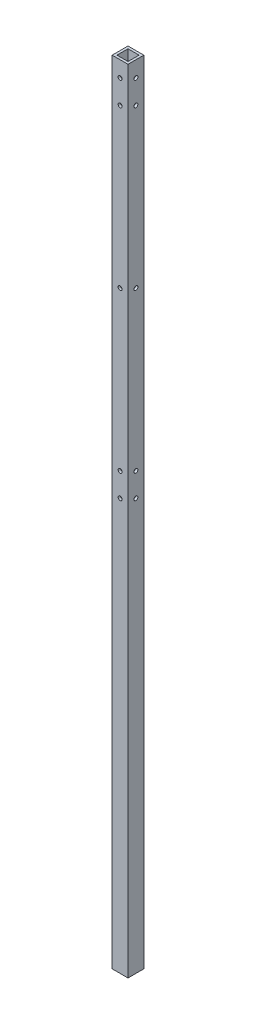
ISO-10303-21;
HEADER;
FILE_DESCRIPTION(('STEP AP214'),'2;1');
FILE_NAME('part.step','',(''),(''),'','','');
FILE_SCHEMA(('AUTOMOTIVE_DESIGN { 1 0 10303 214 1 1 1 1 }'));
ENDSEC;
DATA;
#1=APPLICATION_CONTEXT('core data for automotive mechanical design processes');
#2=APPLICATION_PROTOCOL_DEFINITION('international standard','automotive_design',2000,#1);
#3=PRODUCT_CONTEXT('',#1,'mechanical');
#4=PRODUCT('Part','Part','',(#3));
#5=PRODUCT_RELATED_PRODUCT_CATEGORY('part','',(#4));
#6=PRODUCT_DEFINITION_FORMATION('','',#4);
#7=PRODUCT_DEFINITION_CONTEXT('part definition',#1,'design');
#8=PRODUCT_DEFINITION('design','',#6,#7);
#9=PRODUCT_DEFINITION_SHAPE('','',#8);
#10=(LENGTH_UNIT() NAMED_UNIT(*) SI_UNIT(.MILLI.,.METRE.));
#11=(NAMED_UNIT(*) PLANE_ANGLE_UNIT() SI_UNIT($,.RADIAN.));
#12=(NAMED_UNIT(*) SI_UNIT($,.STERADIAN.) SOLID_ANGLE_UNIT());
#13=UNCERTAINTY_MEASURE_WITH_UNIT(LENGTH_MEASURE(1.E-05),#10,'distance_accuracy_value','');
#14=(GEOMETRIC_REPRESENTATION_CONTEXT(3) GLOBAL_UNCERTAINTY_ASSIGNED_CONTEXT((#13)) GLOBAL_UNIT_ASSIGNED_CONTEXT((#10,
#11,#12)) REPRESENTATION_CONTEXT('',''));
#15=CARTESIAN_POINT('',(0.,0.,0.));
#16=DIRECTION('',(0.,0.,1.));
#17=DIRECTION('',(1.,0.,0.));
#18=AXIS2_PLACEMENT_3D('',#15,#16,#17);
#19=CARTESIAN_POINT('',(10.,520.,-10.));
#20=DIRECTION('',(1.,0.,0.));
#21=DIRECTION('',(0.,0.,-1.));
#22=AXIS2_PLACEMENT_3D('',#19,#20,#21);
#23=CYLINDRICAL_SURFACE('',#22,2.5);
#24=CARTESIAN_POINT('',(17.,520.,-10.));
#25=DIRECTION('',(-1.,0.,0.));
#26=DIRECTION('',(0.,0.,1.));
#27=AXIS2_PLACEMENT_3D('',#24,#25,#26);
#28=CIRCLE('',#27,2.5);
#29=CARTESIAN_POINT('',(17.,520.,-7.5));
#30=VERTEX_POINT('',#29);
#31=EDGE_CURVE('E47',#30,#30,#28,.T.);
#32=ORIENTED_EDGE('',*,*,#31,.T.);
#33=EDGE_LOOP('',(#32));
#34=FACE_BOUND('',#33,.T.);
#35=CARTESIAN_POINT('',(20.,520.,-10.));
#36=DIRECTION('',(1.,0.,0.));
#37=DIRECTION('',(0.,0.,-1.));
#38=AXIS2_PLACEMENT_3D('',#35,#36,#37);
#39=CIRCLE('',#38,2.5);
#40=CARTESIAN_POINT('',(20.,520.,-12.5));
#41=VERTEX_POINT('',#40);
#42=EDGE_CURVE('E11',#41,#41,#39,.T.);
#43=ORIENTED_EDGE('',*,*,#42,.T.);
#44=EDGE_LOOP('',(#43));
#45=FACE_BOUND('',#44,.T.);
#46=ADVANCED_FACE('F38',(#34,#45),#23,.F.);
#47=CARTESIAN_POINT('',(0.,1000.,0.));
#48=DIRECTION('',(0.,-1.,0.));
#49=DIRECTION('',(0.,0.,-1.));
#50=AXIS2_PLACEMENT_3D('',#47,#48,#49);
#51=PLANE('',#50);
#52=DIRECTION('',(0.,0.,1.));
#53=VECTOR('',#52,1.);
#54=CARTESIAN_POINT('',(0.,1000.,0.));
#55=LINE('',#54,#53);
#56=CARTESIAN_POINT('',(0.,1000.,-20.));
#57=VERTEX_POINT('',#56);
#58=CARTESIAN_POINT('',(0.,1000.,0.));
#59=VERTEX_POINT('',#58);
#60=EDGE_CURVE('E156',#57,#59,#55,.T.);
#61=ORIENTED_EDGE('',*,*,#60,.T.);
#62=DIRECTION('',(1.,0.,0.));
#63=VECTOR('',#62,1.);
#64=CARTESIAN_POINT('',(0.,1000.,0.));
#65=LINE('',#64,#63);
#66=CARTESIAN_POINT('',(20.,1000.,0.));
#67=VERTEX_POINT('',#66);
#68=EDGE_CURVE('E160',#59,#67,#65,.T.);
#69=ORIENTED_EDGE('',*,*,#68,.T.);
#70=DIRECTION('',(0.,0.,-1.));
#71=VECTOR('',#70,1.);
#72=CARTESIAN_POINT('',(20.,1000.,0.));
#73=LINE('',#72,#71);
#74=CARTESIAN_POINT('',(20.,1000.,-20.));
#75=VERTEX_POINT('',#74);
#76=EDGE_CURVE('E164',#67,#75,#73,.T.);
#77=ORIENTED_EDGE('',*,*,#76,.T.);
#78=DIRECTION('',(-1.,0.,0.));
#79=VECTOR('',#78,1.);
#80=CARTESIAN_POINT('',(0.,1000.,-20.));
#81=LINE('',#80,#79);
#82=EDGE_CURVE('E167',#75,#57,#81,.T.);
#83=ORIENTED_EDGE('',*,*,#82,.T.);
#84=EDGE_LOOP('',(#61,#69,#77,#83));
#85=FACE_BOUND('',#84,.T.);
#86=DIRECTION('',(0.,0.,1.));
#87=VECTOR('',#86,1.);
#88=CARTESIAN_POINT('',(3.,1000.,-17.));
#89=LINE('',#88,#87);
#90=CARTESIAN_POINT('',(3.,1000.,-17.));
#91=VERTEX_POINT('',#90);
#92=CARTESIAN_POINT('',(3.,1000.,-3.));
#93=VERTEX_POINT('',#92);
#94=EDGE_CURVE('E105',#91,#93,#89,.T.);
#95=ORIENTED_EDGE('',*,*,#94,.F.);
#96=DIRECTION('',(-1.,0.,0.));
#97=VECTOR('',#96,1.);
#98=CARTESIAN_POINT('',(3.,1000.,-17.));
#99=LINE('',#98,#97);
#100=CARTESIAN_POINT('',(17.,1000.,-17.));
#101=VERTEX_POINT('',#100);
#102=EDGE_CURVE('E132',#101,#91,#99,.T.);
#103=ORIENTED_EDGE('',*,*,#102,.F.);
#104=DIRECTION('',(0.,0.,-1.));
#105=VECTOR('',#104,1.);
#106=CARTESIAN_POINT('',(17.,1000.,-17.));
#107=LINE('',#106,#105);
#108=CARTESIAN_POINT('',(17.,1000.,-3.));
#109=VERTEX_POINT('',#108);
#110=EDGE_CURVE('E128',#109,#101,#107,.T.);
#111=ORIENTED_EDGE('',*,*,#110,.F.);
#112=DIRECTION('',(1.,0.,0.));
#113=VECTOR('',#112,1.);
#114=CARTESIAN_POINT('',(3.,1000.,-3.));
#115=LINE('',#114,#113);
#116=EDGE_CURVE('E114',#93,#109,#115,.T.);
#117=ORIENTED_EDGE('',*,*,#116,.F.);
#118=EDGE_LOOP('',(#95,#103,#111,#117));
#119=FACE_BOUND('',#118,.T.);
#120=ADVANCED_FACE('F127',(#85,#119),#51,.F.);
#121=CARTESIAN_POINT('',(0.,0.,0.));
#122=DIRECTION('',(0.,-1.,0.));
#123=DIRECTION('',(0.,0.,-1.));
#124=AXIS2_PLACEMENT_3D('',#121,#122,#123);
#125=PLANE('',#124);
#126=DIRECTION('',(0.,0.,1.));
#127=VECTOR('',#126,1.);
#128=CARTESIAN_POINT('',(0.,0.,0.));
#129=LINE('',#128,#127);
#130=CARTESIAN_POINT('',(0.,0.,-20.));
#131=VERTEX_POINT('',#130);
#132=CARTESIAN_POINT('',(0.,0.,0.));
#133=VERTEX_POINT('',#132);
#134=EDGE_CURVE('E123',#131,#133,#129,.T.);
#135=ORIENTED_EDGE('',*,*,#134,.F.);
#136=DIRECTION('',(-1.,0.,0.));
#137=VECTOR('',#136,1.);
#138=CARTESIAN_POINT('',(0.,0.,-20.));
#139=LINE('',#138,#137);
#140=CARTESIAN_POINT('',(20.,0.,-20.));
#141=VERTEX_POINT('',#140);
#142=EDGE_CURVE('E161',#141,#131,#139,.T.);
#143=ORIENTED_EDGE('',*,*,#142,.F.);
#144=DIRECTION('',(0.,0.,-1.));
#145=VECTOR('',#144,1.);
#146=CARTESIAN_POINT('',(20.,0.,0.));
#147=LINE('',#146,#145);
#148=CARTESIAN_POINT('',(20.,0.,0.));
#149=VERTEX_POINT('',#148);
#150=EDGE_CURVE('E177',#149,#141,#147,.T.);
#151=ORIENTED_EDGE('',*,*,#150,.F.);
#152=DIRECTION('',(1.,0.,0.));
#153=VECTOR('',#152,1.);
#154=CARTESIAN_POINT('',(0.,0.,0.));
#155=LINE('',#154,#153);
#156=EDGE_CURVE('E174',#133,#149,#155,.T.);
#157=ORIENTED_EDGE('',*,*,#156,.F.);
#158=EDGE_LOOP('',(#135,#143,#151,#157));
#159=FACE_BOUND('',#158,.T.);
#160=DIRECTION('',(-1.,0.,0.));
#161=VECTOR('',#160,1.);
#162=CARTESIAN_POINT('',(3.,0.,-17.));
#163=LINE('',#162,#161);
#164=CARTESIAN_POINT('',(17.,0.,-17.));
#165=VERTEX_POINT('',#164);
#166=CARTESIAN_POINT('',(3.,0.,-17.));
#167=VERTEX_POINT('',#166);
#168=EDGE_CURVE('E115',#165,#167,#163,.T.);
#169=ORIENTED_EDGE('',*,*,#168,.T.);
#170=DIRECTION('',(0.,0.,1.));
#171=VECTOR('',#170,1.);
#172=CARTESIAN_POINT('',(3.,0.,-17.));
#173=LINE('',#172,#171);
#174=CARTESIAN_POINT('',(3.,0.,-3.));
#175=VERTEX_POINT('',#174);
#176=EDGE_CURVE('E63',#167,#175,#173,.T.);
#177=ORIENTED_EDGE('',*,*,#176,.T.);
#178=DIRECTION('',(1.,0.,0.));
#179=VECTOR('',#178,1.);
#180=CARTESIAN_POINT('',(3.,0.,-3.));
#181=LINE('',#180,#179);
#182=CARTESIAN_POINT('',(17.,0.,-3.));
#183=VERTEX_POINT('',#182);
#184=EDGE_CURVE('E121',#175,#183,#181,.T.);
#185=ORIENTED_EDGE('',*,*,#184,.T.);
#186=DIRECTION('',(0.,0.,-1.));
#187=VECTOR('',#186,1.);
#188=CARTESIAN_POINT('',(17.,0.,-17.));
#189=LINE('',#188,#187);
#190=EDGE_CURVE('E143',#183,#165,#189,.T.);
#191=ORIENTED_EDGE('',*,*,#190,.T.);
#192=EDGE_LOOP('',(#169,#177,#185,#191));
#193=FACE_BOUND('',#192,.T.);
#194=ADVANCED_FACE('F333',(#159,#193),#125,.T.);
#195=CARTESIAN_POINT('',(0.,1000.,0.));
#196=DIRECTION('',(1.,0.,0.));
#197=DIRECTION('',(0.,0.,-1.));
#198=AXIS2_PLACEMENT_3D('',#195,#196,#197);
#199=PLANE('',#198);
#200=CARTESIAN_POINT('',(0.,950.,-10.));
#201=DIRECTION('',(-1.,0.,0.));
#202=DIRECTION('',(0.,0.,1.));
#203=AXIS2_PLACEMENT_3D('',#200,#201,#202);
#204=CIRCLE('',#203,2.5);
#205=CARTESIAN_POINT('',(0.,950.,-7.5));
#206=VERTEX_POINT('',#205);
#207=EDGE_CURVE('E254',#206,#206,#204,.T.);
#208=ORIENTED_EDGE('',*,*,#207,.F.);
#209=EDGE_LOOP('',(#208));
#210=FACE_BOUND('',#209,.T.);
#211=CARTESIAN_POINT('',(0.,550.,-10.));
#212=DIRECTION('',(-1.,0.,0.));
#213=DIRECTION('',(0.,0.,1.));
#214=AXIS2_PLACEMENT_3D('',#211,#212,#213);
#215=CIRCLE('',#214,2.5);
#216=CARTESIAN_POINT('',(0.,550.,-7.5));
#217=VERTEX_POINT('',#216);
#218=EDGE_CURVE('E262',#217,#217,#215,.T.);
#219=ORIENTED_EDGE('',*,*,#218,.F.);
#220=EDGE_LOOP('',(#219));
#221=FACE_BOUND('',#220,.T.);
#222=CARTESIAN_POINT('',(0.,980.,-10.));
#223=DIRECTION('',(-1.,0.,0.));
#224=DIRECTION('',(0.,0.,1.));
#225=AXIS2_PLACEMENT_3D('',#222,#223,#224);
#226=CIRCLE('',#225,2.5);
#227=CARTESIAN_POINT('',(0.,980.,-7.5));
#228=VERTEX_POINT('',#227);
#229=EDGE_CURVE('E223',#228,#228,#226,.T.);
#230=ORIENTED_EDGE('',*,*,#229,.F.);
#231=EDGE_LOOP('',(#230));
#232=FACE_BOUND('',#231,.T.);
#233=CARTESIAN_POINT('',(0.,750.,-10.));
#234=DIRECTION('',(-1.,0.,0.));
#235=DIRECTION('',(0.,0.,1.));
#236=AXIS2_PLACEMENT_3D('',#233,#234,#235);
#237=CIRCLE('',#236,2.5);
#238=CARTESIAN_POINT('',(0.,750.,-7.5));
#239=VERTEX_POINT('',#238);
#240=EDGE_CURVE('E285',#239,#239,#237,.T.);
#241=ORIENTED_EDGE('',*,*,#240,.F.);
#242=EDGE_LOOP('',(#241));
#243=FACE_BOUND('',#242,.T.);
#244=CARTESIAN_POINT('',(0.,520.,-10.));
#245=DIRECTION('',(-1.,0.,0.));
#246=DIRECTION('',(0.,0.,1.));
#247=AXIS2_PLACEMENT_3D('',#244,#245,#246);
#248=CIRCLE('',#247,2.5);
#249=CARTESIAN_POINT('',(0.,520.,-7.5));
#250=VERTEX_POINT('',#249);
#251=EDGE_CURVE('E236',#250,#250,#248,.T.);
#252=ORIENTED_EDGE('',*,*,#251,.F.);
#253=EDGE_LOOP('',(#252));
#254=FACE_BOUND('',#253,.T.);
#255=ORIENTED_EDGE('',*,*,#134,.T.);
#256=DIRECTION('',(0.,-1.,0.));
#257=VECTOR('',#256,1.);
#258=CARTESIAN_POINT('',(0.,1000.,0.));
#259=LINE('',#258,#257);
#260=EDGE_CURVE('E193',#59,#133,#259,.T.);
#261=ORIENTED_EDGE('',*,*,#260,.F.);
#262=ORIENTED_EDGE('',*,*,#60,.F.);
#263=DIRECTION('',(0.,-1.,0.));
#264=VECTOR('',#263,1.);
#265=CARTESIAN_POINT('',(0.,1000.,-20.));
#266=LINE('',#265,#264);
#267=EDGE_CURVE('E170',#57,#131,#266,.T.);
#268=ORIENTED_EDGE('',*,*,#267,.T.);
#269=EDGE_LOOP('',(#255,#261,#262,#268));
#270=FACE_BOUND('',#269,.T.);
#271=ADVANCED_FACE('F359',(#210,#221,#232,#243,#254,#270),#199,.F.);
#272=CARTESIAN_POINT('',(0.,1000.,0.));
#273=DIRECTION('',(0.,0.,-1.));
#274=DIRECTION('',(-1.,0.,0.));
#275=AXIS2_PLACEMENT_3D('',#272,#273,#274);
#276=PLANE('',#275);
#277=CARTESIAN_POINT('',(9.99999999999996,950.,0.));
#278=DIRECTION('',(0.,0.,1.));
#279=DIRECTION('',(1.,0.,0.));
#280=AXIS2_PLACEMENT_3D('',#277,#278,#279);
#281=CIRCLE('',#280,2.5);
#282=CARTESIAN_POINT('',(12.5,950.,0.));
#283=VERTEX_POINT('',#282);
#284=EDGE_CURVE('E248',#283,#283,#281,.T.);
#285=ORIENTED_EDGE('',*,*,#284,.F.);
#286=EDGE_LOOP('',(#285));
#287=FACE_BOUND('',#286,.T.);
#288=CARTESIAN_POINT('',(9.99999999999997,550.,0.));
#289=DIRECTION('',(0.,0.,1.));
#290=DIRECTION('',(1.,0.,0.));
#291=AXIS2_PLACEMENT_3D('',#288,#289,#290);
#292=CIRCLE('',#291,2.5);
#293=CARTESIAN_POINT('',(12.5,550.,0.));
#294=VERTEX_POINT('',#293);
#295=EDGE_CURVE('E260',#294,#294,#292,.T.);
#296=ORIENTED_EDGE('',*,*,#295,.F.);
#297=EDGE_LOOP('',(#296));
#298=FACE_BOUND('',#297,.T.);
#299=CARTESIAN_POINT('',(9.99999999999996,980.,0.));
#300=DIRECTION('',(0.,0.,1.));
#301=DIRECTION('',(1.,0.,0.));
#302=AXIS2_PLACEMENT_3D('',#299,#300,#301);
#303=CIRCLE('',#302,2.5);
#304=CARTESIAN_POINT('',(12.5,980.,0.));
#305=VERTEX_POINT('',#304);
#306=EDGE_CURVE('E209',#305,#305,#303,.T.);
#307=ORIENTED_EDGE('',*,*,#306,.F.);
#308=EDGE_LOOP('',(#307));
#309=FACE_BOUND('',#308,.T.);
#310=CARTESIAN_POINT('',(9.99999999999996,750.,0.));
#311=DIRECTION('',(0.,0.,1.));
#312=DIRECTION('',(1.,0.,0.));
#313=AXIS2_PLACEMENT_3D('',#310,#311,#312);
#314=CIRCLE('',#313,2.5);
#315=CARTESIAN_POINT('',(12.5,750.,0.));
#316=VERTEX_POINT('',#315);
#317=EDGE_CURVE('E295',#316,#316,#314,.T.);
#318=ORIENTED_EDGE('',*,*,#317,.F.);
#319=EDGE_LOOP('',(#318));
#320=FACE_BOUND('',#319,.T.);
#321=CARTESIAN_POINT('',(9.99999999999996,520.,0.));
#322=DIRECTION('',(0.,0.,1.));
#323=DIRECTION('',(1.,0.,0.));
#324=AXIS2_PLACEMENT_3D('',#321,#322,#323);
#325=CIRCLE('',#324,2.5);
#326=CARTESIAN_POINT('',(12.5,520.,0.));
#327=VERTEX_POINT('',#326);
#328=EDGE_CURVE('E231',#327,#327,#325,.T.);
#329=ORIENTED_EDGE('',*,*,#328,.F.);
#330=EDGE_LOOP('',(#329));
#331=FACE_BOUND('',#330,.T.);
#332=ORIENTED_EDGE('',*,*,#156,.T.);
#333=DIRECTION('',(0.,-1.,0.));
#334=VECTOR('',#333,1.);
#335=CARTESIAN_POINT('',(20.,1000.,0.));
#336=LINE('',#335,#334);
#337=EDGE_CURVE('E189',#67,#149,#336,.T.);
#338=ORIENTED_EDGE('',*,*,#337,.F.);
#339=ORIENTED_EDGE('',*,*,#68,.F.);
#340=ORIENTED_EDGE('',*,*,#260,.T.);
#341=EDGE_LOOP('',(#332,#338,#339,#340));
#342=FACE_BOUND('',#341,.T.);
#343=ADVANCED_FACE('F318',(#287,#298,#309,#320,#331,#342),#276,.F.);
#344=CARTESIAN_POINT('',(20.,1000.,0.));
#345=DIRECTION('',(-1.,0.,0.));
#346=DIRECTION('',(0.,0.,1.));
#347=AXIS2_PLACEMENT_3D('',#344,#345,#346);
#348=PLANE('',#347);
#349=CARTESIAN_POINT('',(20.,550.,-10.));
#350=DIRECTION('',(1.,0.,0.));
#351=DIRECTION('',(0.,0.,-1.));
#352=AXIS2_PLACEMENT_3D('',#349,#350,#351);
#353=CIRCLE('',#352,2.5);
#354=CARTESIAN_POINT('',(20.,550.,-12.5));
#355=VERTEX_POINT('',#354);
#356=EDGE_CURVE('E242',#355,#355,#353,.T.);
#357=ORIENTED_EDGE('',*,*,#356,.F.);
#358=EDGE_LOOP('',(#357));
#359=FACE_BOUND('',#358,.T.);
#360=CARTESIAN_POINT('',(20.,950.,-10.));
#361=DIRECTION('',(1.,0.,0.));
#362=DIRECTION('',(0.,0.,-1.));
#363=AXIS2_PLACEMENT_3D('',#360,#361,#362);
#364=CIRCLE('',#363,2.5);
#365=CARTESIAN_POINT('',(20.,950.,-12.5));
#366=VERTEX_POINT('',#365);
#367=EDGE_CURVE('E237',#366,#366,#364,.T.);
#368=ORIENTED_EDGE('',*,*,#367,.F.);
#369=EDGE_LOOP('',(#368));
#370=FACE_BOUND('',#369,.T.);
#371=CARTESIAN_POINT('',(20.,750.,-10.));
#372=DIRECTION('',(1.,0.,0.));
#373=DIRECTION('',(0.,0.,-1.));
#374=AXIS2_PLACEMENT_3D('',#371,#372,#373);
#375=CIRCLE('',#374,2.5);
#376=CARTESIAN_POINT('',(20.,750.,-12.5));
#377=VERTEX_POINT('',#376);
#378=EDGE_CURVE('E305',#377,#377,#375,.T.);
#379=ORIENTED_EDGE('',*,*,#378,.F.);
#380=EDGE_LOOP('',(#379));
#381=FACE_BOUND('',#380,.T.);
#382=CARTESIAN_POINT('',(20.,980.,-10.));
#383=DIRECTION('',(1.,0.,0.));
#384=DIRECTION('',(0.,0.,-1.));
#385=AXIS2_PLACEMENT_3D('',#382,#383,#384);
#386=CIRCLE('',#385,2.5);
#387=CARTESIAN_POINT('',(20.,980.,-12.5));
#388=VERTEX_POINT('',#387);
#389=EDGE_CURVE('E200',#388,#388,#386,.T.);
#390=ORIENTED_EDGE('',*,*,#389,.F.);
#391=EDGE_LOOP('',(#390));
#392=FACE_BOUND('',#391,.T.);
#393=ORIENTED_EDGE('',*,*,#150,.T.);
#394=DIRECTION('',(0.,-1.,0.));
#395=VECTOR('',#394,1.);
#396=CARTESIAN_POINT('',(20.,1000.,-20.));
#397=LINE('',#396,#395);
#398=EDGE_CURVE('E185',#75,#141,#397,.T.);
#399=ORIENTED_EDGE('',*,*,#398,.F.);
#400=ORIENTED_EDGE('',*,*,#76,.F.);
#401=ORIENTED_EDGE('',*,*,#337,.T.);
#402=EDGE_LOOP('',(#393,#399,#400,#401));
#403=FACE_BOUND('',#402,.T.);
#404=ORIENTED_EDGE('',*,*,#42,.F.);
#405=EDGE_LOOP('',(#404));
#406=FACE_BOUND('',#405,.T.);
#407=ADVANCED_FACE('F314',(#359,#370,#381,#392,#403,#406),#348,.F.);
#408=CARTESIAN_POINT('',(0.,1000.,-20.));
#409=DIRECTION('',(0.,0.,1.));
#410=DIRECTION('',(1.,0.,0.));
#411=AXIS2_PLACEMENT_3D('',#408,#409,#410);
#412=PLANE('',#411);
#413=ORIENTED_EDGE('',*,*,#142,.T.);
#414=ORIENTED_EDGE('',*,*,#267,.F.);
#415=ORIENTED_EDGE('',*,*,#82,.F.);
#416=ORIENTED_EDGE('',*,*,#398,.T.);
#417=EDGE_LOOP('',(#413,#414,#415,#416));
#418=FACE_BOUND('',#417,.T.);
#419=ADVANCED_FACE('F317',(#418),#412,.F.);
#420=CARTESIAN_POINT('',(3.,1000.,-17.));
#421=DIRECTION('',(1.,0.,0.));
#422=DIRECTION('',(0.,0.,-1.));
#423=AXIS2_PLACEMENT_3D('',#420,#421,#422);
#424=PLANE('',#423);
#425=CARTESIAN_POINT('',(3.,950.,-10.));
#426=DIRECTION('',(1.,0.,0.));
#427=DIRECTION('',(0.,0.,-1.));
#428=AXIS2_PLACEMENT_3D('',#425,#426,#427);
#429=CIRCLE('',#428,2.5);
#430=CARTESIAN_POINT('',(3.,950.,-12.5));
#431=VERTEX_POINT('',#430);
#432=EDGE_CURVE('E41',#431,#431,#429,.T.);
#433=ORIENTED_EDGE('',*,*,#432,.F.);
#434=EDGE_LOOP('',(#433));
#435=FACE_BOUND('',#434,.T.);
#436=CARTESIAN_POINT('',(3.,550.,-10.));
#437=DIRECTION('',(1.,0.,0.));
#438=DIRECTION('',(0.,0.,-1.));
#439=AXIS2_PLACEMENT_3D('',#436,#437,#438);
#440=CIRCLE('',#439,2.5);
#441=CARTESIAN_POINT('',(3.,550.,-12.5));
#442=VERTEX_POINT('',#441);
#443=EDGE_CURVE('E251',#442,#442,#440,.T.);
#444=ORIENTED_EDGE('',*,*,#443,.F.);
#445=EDGE_LOOP('',(#444));
#446=FACE_BOUND('',#445,.T.);
#447=CARTESIAN_POINT('',(3.,980.,-10.));
#448=DIRECTION('',(1.,0.,0.));
#449=DIRECTION('',(0.,0.,-1.));
#450=AXIS2_PLACEMENT_3D('',#447,#448,#449);
#451=CIRCLE('',#450,2.5);
#452=CARTESIAN_POINT('',(3.,980.,-12.5));
#453=VERTEX_POINT('',#452);
#454=EDGE_CURVE('E227',#453,#453,#451,.T.);
#455=ORIENTED_EDGE('',*,*,#454,.F.);
#456=EDGE_LOOP('',(#455));
#457=FACE_BOUND('',#456,.T.);
#458=CARTESIAN_POINT('',(3.,750.,-10.));
#459=DIRECTION('',(1.,0.,0.));
#460=DIRECTION('',(0.,0.,-1.));
#461=AXIS2_PLACEMENT_3D('',#458,#459,#460);
#462=CIRCLE('',#461,2.5);
#463=CARTESIAN_POINT('',(3.,750.,-12.5));
#464=VERTEX_POINT('',#463);
#465=EDGE_CURVE('E222',#464,#464,#462,.T.);
#466=ORIENTED_EDGE('',*,*,#465,.F.);
#467=EDGE_LOOP('',(#466));
#468=FACE_BOUND('',#467,.T.);
#469=CARTESIAN_POINT('',(3.,520.,-10.));
#470=DIRECTION('',(1.,0.,0.));
#471=DIRECTION('',(0.,0.,-1.));
#472=AXIS2_PLACEMENT_3D('',#469,#470,#471);
#473=CIRCLE('',#472,2.5);
#474=CARTESIAN_POINT('',(3.,520.,-12.5));
#475=VERTEX_POINT('',#474);
#476=EDGE_CURVE('E218',#475,#475,#473,.T.);
#477=ORIENTED_EDGE('',*,*,#476,.F.);
#478=EDGE_LOOP('',(#477));
#479=FACE_BOUND('',#478,.T.);
#480=ORIENTED_EDGE('',*,*,#176,.F.);
#481=DIRECTION('',(0.,-1.,0.));
#482=VECTOR('',#481,1.);
#483=CARTESIAN_POINT('',(3.,1000.,-17.));
#484=LINE('',#483,#482);
#485=EDGE_CURVE('E109',#91,#167,#484,.T.);
#486=ORIENTED_EDGE('',*,*,#485,.F.);
#487=ORIENTED_EDGE('',*,*,#94,.T.);
#488=DIRECTION('',(0.,-1.,0.));
#489=VECTOR('',#488,1.);
#490=CARTESIAN_POINT('',(3.,1000.,-3.));
#491=LINE('',#490,#489);
#492=EDGE_CURVE('E108',#93,#175,#491,.T.);
#493=ORIENTED_EDGE('',*,*,#492,.T.);
#494=EDGE_LOOP('',(#480,#486,#487,#493));
#495=FACE_BOUND('',#494,.T.);
#496=ADVANCED_FACE('F107',(#435,#446,#457,#468,#479,#495),#424,.T.);
#497=CARTESIAN_POINT('',(3.,1000.,-3.));
#498=DIRECTION('',(0.,0.,-1.));
#499=DIRECTION('',(-1.,0.,0.));
#500=AXIS2_PLACEMENT_3D('',#497,#498,#499);
#501=PLANE('',#500);
#502=CARTESIAN_POINT('',(9.99999999999997,950.,-3.));
#503=DIRECTION('',(0.,0.,-1.));
#504=DIRECTION('',(-1.,0.,0.));
#505=AXIS2_PLACEMENT_3D('',#502,#503,#504);
#506=CIRCLE('',#505,2.5);
#507=CARTESIAN_POINT('',(7.49999999999997,950.,-3.));
#508=VERTEX_POINT('',#507);
#509=EDGE_CURVE('E247',#508,#508,#506,.T.);
#510=ORIENTED_EDGE('',*,*,#509,.F.);
#511=EDGE_LOOP('',(#510));
#512=FACE_BOUND('',#511,.T.);
#513=CARTESIAN_POINT('',(9.99999999999998,550.,-3.));
#514=DIRECTION('',(0.,0.,-1.));
#515=DIRECTION('',(-1.,0.,0.));
#516=AXIS2_PLACEMENT_3D('',#513,#514,#515);
#517=CIRCLE('',#516,2.5);
#518=CARTESIAN_POINT('',(7.49999999999998,550.,-3.));
#519=VERTEX_POINT('',#518);
#520=EDGE_CURVE('E243',#519,#519,#517,.T.);
#521=ORIENTED_EDGE('',*,*,#520,.F.);
#522=EDGE_LOOP('',(#521));
#523=FACE_BOUND('',#522,.T.);
#524=CARTESIAN_POINT('',(9.99999999999997,980.,-3.));
#525=DIRECTION('',(0.,0.,-1.));
#526=DIRECTION('',(-1.,0.,0.));
#527=AXIS2_PLACEMENT_3D('',#524,#525,#526);
#528=CIRCLE('',#527,2.5);
#529=CARTESIAN_POINT('',(7.49999999999997,980.,-3.));
#530=VERTEX_POINT('',#529);
#531=EDGE_CURVE('E213',#530,#530,#528,.T.);
#532=ORIENTED_EDGE('',*,*,#531,.F.);
#533=EDGE_LOOP('',(#532));
#534=FACE_BOUND('',#533,.T.);
#535=CARTESIAN_POINT('',(9.99999999999997,750.,-3.));
#536=DIRECTION('',(0.,0.,-1.));
#537=DIRECTION('',(-1.,0.,0.));
#538=AXIS2_PLACEMENT_3D('',#535,#536,#537);
#539=CIRCLE('',#538,2.5);
#540=CARTESIAN_POINT('',(7.49999999999997,750.,-3.));
#541=VERTEX_POINT('',#540);
#542=EDGE_CURVE('E208',#541,#541,#539,.T.);
#543=ORIENTED_EDGE('',*,*,#542,.F.);
#544=EDGE_LOOP('',(#543));
#545=FACE_BOUND('',#544,.T.);
#546=CARTESIAN_POINT('',(9.99999999999997,520.,-3.));
#547=DIRECTION('',(0.,0.,-1.));
#548=DIRECTION('',(-1.,0.,0.));
#549=AXIS2_PLACEMENT_3D('',#546,#547,#548);
#550=CIRCLE('',#549,2.5);
#551=CARTESIAN_POINT('',(7.49999999999997,520.,-3.));
#552=VERTEX_POINT('',#551);
#553=EDGE_CURVE('E204',#552,#552,#550,.T.);
#554=ORIENTED_EDGE('',*,*,#553,.F.);
#555=EDGE_LOOP('',(#554));
#556=FACE_BOUND('',#555,.T.);
#557=ORIENTED_EDGE('',*,*,#184,.F.);
#558=ORIENTED_EDGE('',*,*,#492,.F.);
#559=ORIENTED_EDGE('',*,*,#116,.T.);
#560=DIRECTION('',(0.,-1.,0.));
#561=VECTOR('',#560,1.);
#562=CARTESIAN_POINT('',(17.,1000.,-3.));
#563=LINE('',#562,#561);
#564=EDGE_CURVE('E124',#109,#183,#563,.T.);
#565=ORIENTED_EDGE('',*,*,#564,.T.);
#566=EDGE_LOOP('',(#557,#558,#559,#565));
#567=FACE_BOUND('',#566,.T.);
#568=ADVANCED_FACE('F118',(#512,#523,#534,#545,#556,#567),#501,.T.);
#569=CARTESIAN_POINT('',(17.,1000.,-17.));
#570=DIRECTION('',(-1.,0.,0.));
#571=DIRECTION('',(0.,0.,1.));
#572=AXIS2_PLACEMENT_3D('',#569,#570,#571);
#573=PLANE('',#572);
#574=CARTESIAN_POINT('',(17.,550.,-10.));
#575=DIRECTION('',(-1.,0.,0.));
#576=DIRECTION('',(0.,0.,1.));
#577=AXIS2_PLACEMENT_3D('',#574,#575,#576);
#578=CIRCLE('',#577,2.5);
#579=CARTESIAN_POINT('',(17.,550.,-7.5));
#580=VERTEX_POINT('',#579);
#581=EDGE_CURVE('E238',#580,#580,#578,.T.);
#582=ORIENTED_EDGE('',*,*,#581,.F.);
#583=EDGE_LOOP('',(#582));
#584=FACE_BOUND('',#583,.T.);
#585=CARTESIAN_POINT('',(17.,950.,-10.));
#586=DIRECTION('',(-1.,0.,0.));
#587=DIRECTION('',(0.,0.,1.));
#588=AXIS2_PLACEMENT_3D('',#585,#586,#587);
#589=CIRCLE('',#588,2.5);
#590=CARTESIAN_POINT('',(17.,950.,-7.5));
#591=VERTEX_POINT('',#590);
#592=EDGE_CURVE('E232',#591,#591,#589,.T.);
#593=ORIENTED_EDGE('',*,*,#592,.F.);
#594=EDGE_LOOP('',(#593));
#595=FACE_BOUND('',#594,.T.);
#596=CARTESIAN_POINT('',(17.,750.,-10.));
#597=DIRECTION('',(-1.,0.,0.));
#598=DIRECTION('',(0.,0.,1.));
#599=AXIS2_PLACEMENT_3D('',#596,#597,#598);
#600=CIRCLE('',#599,2.5);
#601=CARTESIAN_POINT('',(17.,750.,-7.5));
#602=VERTEX_POINT('',#601);
#603=EDGE_CURVE('E217',#602,#602,#600,.T.);
#604=ORIENTED_EDGE('',*,*,#603,.F.);
#605=EDGE_LOOP('',(#604));
#606=FACE_BOUND('',#605,.T.);
#607=CARTESIAN_POINT('',(17.,980.,-10.));
#608=DIRECTION('',(-1.,0.,0.));
#609=DIRECTION('',(0.,0.,1.));
#610=AXIS2_PLACEMENT_3D('',#607,#608,#609);
#611=CIRCLE('',#610,2.5);
#612=CARTESIAN_POINT('',(17.,980.,-7.5));
#613=VERTEX_POINT('',#612);
#614=EDGE_CURVE('E140',#613,#613,#611,.T.);
#615=ORIENTED_EDGE('',*,*,#614,.F.);
#616=EDGE_LOOP('',(#615));
#617=FACE_BOUND('',#616,.T.);
#618=ORIENTED_EDGE('',*,*,#190,.F.);
#619=ORIENTED_EDGE('',*,*,#564,.F.);
#620=ORIENTED_EDGE('',*,*,#110,.T.);
#621=DIRECTION('',(0.,-1.,0.));
#622=VECTOR('',#621,1.);
#623=CARTESIAN_POINT('',(17.,1000.,-17.));
#624=LINE('',#623,#622);
#625=EDGE_CURVE('E55',#101,#165,#624,.T.);
#626=ORIENTED_EDGE('',*,*,#625,.T.);
#627=EDGE_LOOP('',(#618,#619,#620,#626));
#628=FACE_BOUND('',#627,.T.);
#629=ORIENTED_EDGE('',*,*,#31,.F.);
#630=EDGE_LOOP('',(#629));
#631=FACE_BOUND('',#630,.T.);
#632=ADVANCED_FACE('F338',(#584,#595,#606,#617,#628,#631),#573,.T.);
#633=CARTESIAN_POINT('',(3.,1000.,-17.));
#634=DIRECTION('',(0.,0.,1.));
#635=DIRECTION('',(1.,0.,0.));
#636=AXIS2_PLACEMENT_3D('',#633,#634,#635);
#637=PLANE('',#636);
#638=ORIENTED_EDGE('',*,*,#168,.F.);
#639=ORIENTED_EDGE('',*,*,#625,.F.);
#640=ORIENTED_EDGE('',*,*,#102,.T.);
#641=ORIENTED_EDGE('',*,*,#485,.T.);
#642=EDGE_LOOP('',(#638,#639,#640,#641));
#643=FACE_BOUND('',#642,.T.);
#644=ADVANCED_FACE('F340',(#643),#637,.T.);
#645=CARTESIAN_POINT('',(10.,980.,-10.));
#646=DIRECTION('',(1.,0.,0.));
#647=DIRECTION('',(0.,0.,-1.));
#648=AXIS2_PLACEMENT_3D('',#645,#646,#647);
#649=CYLINDRICAL_SURFACE('',#648,2.5);
#650=ORIENTED_EDGE('',*,*,#614,.T.);
#651=EDGE_LOOP('',(#650));
#652=FACE_BOUND('',#651,.T.);
#653=ORIENTED_EDGE('',*,*,#389,.T.);
#654=EDGE_LOOP('',(#653));
#655=FACE_BOUND('',#654,.T.);
#656=ADVANCED_FACE('F312',(#652,#655),#649,.F.);
#657=CARTESIAN_POINT('',(10.,750.,-10.));
#658=DIRECTION('',(1.,0.,0.));
#659=DIRECTION('',(0.,0.,-1.));
#660=AXIS2_PLACEMENT_3D('',#657,#658,#659);
#661=CYLINDRICAL_SURFACE('',#660,2.5);
#662=ORIENTED_EDGE('',*,*,#603,.T.);
#663=EDGE_LOOP('',(#662));
#664=FACE_BOUND('',#663,.T.);
#665=ORIENTED_EDGE('',*,*,#378,.T.);
#666=EDGE_LOOP('',(#665));
#667=FACE_BOUND('',#666,.T.);
#668=ADVANCED_FACE('F416',(#664,#667),#661,.F.);
#669=CARTESIAN_POINT('',(10.,520.,-10.));
#670=DIRECTION('',(0.,0.,1.));
#671=DIRECTION('',(1.,0.,0.));
#672=AXIS2_PLACEMENT_3D('',#669,#670,#671);
#673=CYLINDRICAL_SURFACE('',#672,2.5);
#674=ORIENTED_EDGE('',*,*,#553,.T.);
#675=EDGE_LOOP('',(#674));
#676=FACE_BOUND('',#675,.T.);
#677=ORIENTED_EDGE('',*,*,#328,.T.);
#678=EDGE_LOOP('',(#677));
#679=FACE_BOUND('',#678,.T.);
#680=ADVANCED_FACE('F412',(#676,#679),#673,.F.);
#681=CARTESIAN_POINT('',(10.,750.,-10.));
#682=DIRECTION('',(0.,0.,1.));
#683=DIRECTION('',(1.,0.,0.));
#684=AXIS2_PLACEMENT_3D('',#681,#682,#683);
#685=CYLINDRICAL_SURFACE('',#684,2.5);
#686=ORIENTED_EDGE('',*,*,#542,.T.);
#687=EDGE_LOOP('',(#686));
#688=FACE_BOUND('',#687,.T.);
#689=ORIENTED_EDGE('',*,*,#317,.T.);
#690=EDGE_LOOP('',(#689));
#691=FACE_BOUND('',#690,.T.);
#692=ADVANCED_FACE('F405',(#688,#691),#685,.F.);
#693=CARTESIAN_POINT('',(10.,980.,-10.));
#694=DIRECTION('',(0.,0.,1.));
#695=DIRECTION('',(1.,0.,0.));
#696=AXIS2_PLACEMENT_3D('',#693,#694,#695);
#697=CYLINDRICAL_SURFACE('',#696,2.5);
#698=ORIENTED_EDGE('',*,*,#531,.T.);
#699=EDGE_LOOP('',(#698));
#700=FACE_BOUND('',#699,.T.);
#701=ORIENTED_EDGE('',*,*,#306,.T.);
#702=EDGE_LOOP('',(#701));
#703=FACE_BOUND('',#702,.T.);
#704=ADVANCED_FACE('F395',(#700,#703),#697,.F.);
#705=CARTESIAN_POINT('',(10.,520.,-10.));
#706=DIRECTION('',(-1.,0.,0.));
#707=DIRECTION('',(0.,0.,1.));
#708=AXIS2_PLACEMENT_3D('',#705,#706,#707);
#709=CYLINDRICAL_SURFACE('',#708,2.5);
#710=ORIENTED_EDGE('',*,*,#476,.T.);
#711=EDGE_LOOP('',(#710));
#712=FACE_BOUND('',#711,.T.);
#713=ORIENTED_EDGE('',*,*,#251,.T.);
#714=EDGE_LOOP('',(#713));
#715=FACE_BOUND('',#714,.T.);
#716=ADVANCED_FACE('F392',(#712,#715),#709,.F.);
#717=CARTESIAN_POINT('',(10.,750.,-10.));
#718=DIRECTION('',(-1.,0.,0.));
#719=DIRECTION('',(0.,0.,1.));
#720=AXIS2_PLACEMENT_3D('',#717,#718,#719);
#721=CYLINDRICAL_SURFACE('',#720,2.5);
#722=ORIENTED_EDGE('',*,*,#465,.T.);
#723=EDGE_LOOP('',(#722));
#724=FACE_BOUND('',#723,.T.);
#725=ORIENTED_EDGE('',*,*,#240,.T.);
#726=EDGE_LOOP('',(#725));
#727=FACE_BOUND('',#726,.T.);
#728=ADVANCED_FACE('F394',(#724,#727),#721,.F.);
#729=CARTESIAN_POINT('',(10.,980.,-10.));
#730=DIRECTION('',(-1.,0.,0.));
#731=DIRECTION('',(0.,0.,1.));
#732=AXIS2_PLACEMENT_3D('',#729,#730,#731);
#733=CYLINDRICAL_SURFACE('',#732,2.5);
#734=ORIENTED_EDGE('',*,*,#454,.T.);
#735=EDGE_LOOP('',(#734));
#736=FACE_BOUND('',#735,.T.);
#737=ORIENTED_EDGE('',*,*,#229,.T.);
#738=EDGE_LOOP('',(#737));
#739=FACE_BOUND('',#738,.T.);
#740=ADVANCED_FACE('F402',(#736,#739),#733,.F.);
#741=CARTESIAN_POINT('',(10.,950.,-10.));
#742=DIRECTION('',(1.,0.,0.));
#743=DIRECTION('',(0.,0.,-1.));
#744=AXIS2_PLACEMENT_3D('',#741,#742,#743);
#745=CYLINDRICAL_SURFACE('',#744,2.5);
#746=ORIENTED_EDGE('',*,*,#592,.T.);
#747=EDGE_LOOP('',(#746));
#748=FACE_BOUND('',#747,.T.);
#749=ORIENTED_EDGE('',*,*,#367,.T.);
#750=EDGE_LOOP('',(#749));
#751=FACE_BOUND('',#750,.T.);
#752=ADVANCED_FACE('F461',(#748,#751),#745,.F.);
#753=CARTESIAN_POINT('',(10.,550.,-10.));
#754=DIRECTION('',(1.,0.,0.));
#755=DIRECTION('',(0.,0.,-1.));
#756=AXIS2_PLACEMENT_3D('',#753,#754,#755);
#757=CYLINDRICAL_SURFACE('',#756,2.5);
#758=ORIENTED_EDGE('',*,*,#581,.T.);
#759=EDGE_LOOP('',(#758));
#760=FACE_BOUND('',#759,.T.);
#761=ORIENTED_EDGE('',*,*,#356,.T.);
#762=EDGE_LOOP('',(#761));
#763=FACE_BOUND('',#762,.T.);
#764=ADVANCED_FACE('F469',(#760,#763),#757,.F.);
#765=CARTESIAN_POINT('',(10.,550.,-10.));
#766=DIRECTION('',(0.,0.,1.));
#767=DIRECTION('',(1.,0.,0.));
#768=AXIS2_PLACEMENT_3D('',#765,#766,#767);
#769=CYLINDRICAL_SURFACE('',#768,2.5);
#770=ORIENTED_EDGE('',*,*,#520,.T.);
#771=EDGE_LOOP('',(#770));
#772=FACE_BOUND('',#771,.T.);
#773=ORIENTED_EDGE('',*,*,#295,.T.);
#774=EDGE_LOOP('',(#773));
#775=FACE_BOUND('',#774,.T.);
#776=ADVANCED_FACE('F525',(#772,#775),#769,.F.);
#777=CARTESIAN_POINT('',(10.,950.,-10.));
#778=DIRECTION('',(0.,0.,1.));
#779=DIRECTION('',(1.,0.,0.));
#780=AXIS2_PLACEMENT_3D('',#777,#778,#779);
#781=CYLINDRICAL_SURFACE('',#780,2.5);
#782=ORIENTED_EDGE('',*,*,#509,.T.);
#783=EDGE_LOOP('',(#782));
#784=FACE_BOUND('',#783,.T.);
#785=ORIENTED_EDGE('',*,*,#284,.T.);
#786=EDGE_LOOP('',(#785));
#787=FACE_BOUND('',#786,.T.);
#788=ADVANCED_FACE('F530',(#784,#787),#781,.F.);
#789=CARTESIAN_POINT('',(10.,550.,-10.));
#790=DIRECTION('',(-1.,0.,0.));
#791=DIRECTION('',(0.,0.,1.));
#792=AXIS2_PLACEMENT_3D('',#789,#790,#791);
#793=CYLINDRICAL_SURFACE('',#792,2.5);
#794=ORIENTED_EDGE('',*,*,#443,.T.);
#795=EDGE_LOOP('',(#794));
#796=FACE_BOUND('',#795,.T.);
#797=ORIENTED_EDGE('',*,*,#218,.T.);
#798=EDGE_LOOP('',(#797));
#799=FACE_BOUND('',#798,.T.);
#800=ADVANCED_FACE('F540',(#796,#799),#793,.F.);
#801=CARTESIAN_POINT('',(10.,950.,-10.));
#802=DIRECTION('',(-1.,0.,0.));
#803=DIRECTION('',(0.,0.,1.));
#804=AXIS2_PLACEMENT_3D('',#801,#802,#803);
#805=CYLINDRICAL_SURFACE('',#804,2.5);
#806=ORIENTED_EDGE('',*,*,#432,.T.);
#807=EDGE_LOOP('',(#806));
#808=FACE_BOUND('',#807,.T.);
#809=ORIENTED_EDGE('',*,*,#207,.T.);
#810=EDGE_LOOP('',(#809));
#811=FACE_BOUND('',#810,.T.);
#812=ADVANCED_FACE('F550',(#808,#811),#805,.F.);
#813=CLOSED_SHELL('',(#46,#120,#194,#271,#343,#407,#419,#496,#568,#632,#644,#656,#668,#680,#692,
#704,#716,#728,#740,#752,#764,#776,#788,#800,#812));
#814=MANIFOLD_SOLID_BREP('B2',#813);
#815=ADVANCED_BREP_SHAPE_REPRESENTATION('',(#18,#814),#14);
#816=SHAPE_DEFINITION_REPRESENTATION(#9,#815);
ENDSEC;
END-ISO-10303-21;
